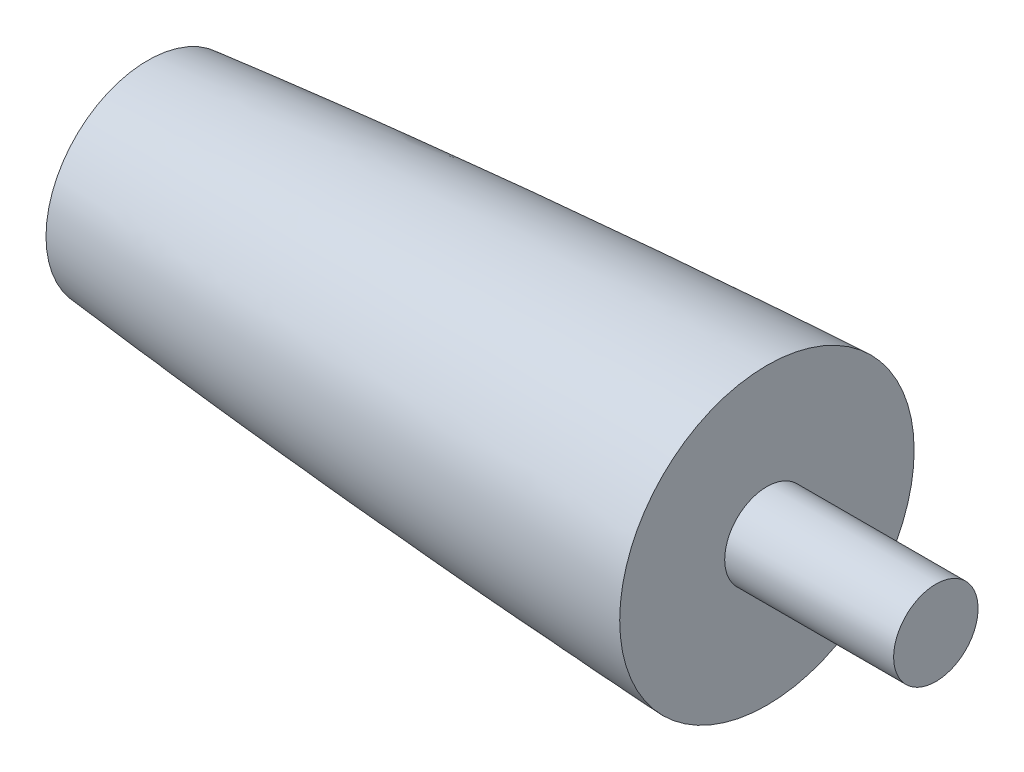
ISO-10303-21;
HEADER;
FILE_DESCRIPTION(('STEP AP214'),'2;1');
FILE_NAME('part.step','',(''),(''),'','','');
FILE_SCHEMA(('AUTOMOTIVE_DESIGN { 1 0 10303 214 1 1 1 1 }'));
ENDSEC;
DATA;
#1=APPLICATION_CONTEXT('core data for automotive mechanical design processes');
#2=APPLICATION_PROTOCOL_DEFINITION('international standard','automotive_design',2000,#1);
#3=PRODUCT_CONTEXT('',#1,'mechanical');
#4=PRODUCT('Part','Part','',(#3));
#5=PRODUCT_RELATED_PRODUCT_CATEGORY('part','',(#4));
#6=PRODUCT_DEFINITION_FORMATION('','',#4);
#7=PRODUCT_DEFINITION_CONTEXT('part definition',#1,'design');
#8=PRODUCT_DEFINITION('design','',#6,#7);
#9=PRODUCT_DEFINITION_SHAPE('','',#8);
#10=(LENGTH_UNIT() NAMED_UNIT(*) SI_UNIT(.MILLI.,.METRE.));
#11=(NAMED_UNIT(*) PLANE_ANGLE_UNIT() SI_UNIT($,.RADIAN.));
#12=(NAMED_UNIT(*) SI_UNIT($,.STERADIAN.) SOLID_ANGLE_UNIT());
#13=UNCERTAINTY_MEASURE_WITH_UNIT(LENGTH_MEASURE(1.E-05),#10,'distance_accuracy_value','');
#14=(GEOMETRIC_REPRESENTATION_CONTEXT(3) GLOBAL_UNCERTAINTY_ASSIGNED_CONTEXT((#13)) GLOBAL_UNIT_ASSIGNED_CONTEXT((#10,
#11,#12)) REPRESENTATION_CONTEXT('',''));
#15=CARTESIAN_POINT('',(0.,0.,0.));
#16=DIRECTION('',(0.,0.,1.));
#17=DIRECTION('',(1.,0.,0.));
#18=AXIS2_PLACEMENT_3D('',#15,#16,#17);
#19=CARTESIAN_POINT('',(186.20000000084,0.,0.));
#20=DIRECTION('',(-1.,0.,0.));
#21=DIRECTION('',(0.,0.,1.));
#22=AXIS2_PLACEMENT_3D('',#19,#20,#21);
#23=CYLINDRICAL_SURFACE('',#22,12.7000000005298);
#24=CARTESIAN_POINT('',(372.400000000217,0.,0.));
#25=DIRECTION('',(-1.,0.,0.));
#26=DIRECTION('',(0.,0.,1.));
#27=AXIS2_PLACEMENT_3D('',#24,#25,#26);
#28=CIRCLE('',#27,12.7000000005298);
#29=CARTESIAN_POINT('',(372.400000000217,0.,12.7000000005298));
#30=VERTEX_POINT('',#29);
#31=EDGE_CURVE('E10',#30,#30,#28,.T.);
#32=ORIENTED_EDGE('',*,*,#31,.F.);
#33=EDGE_LOOP('',(#32));
#34=FACE_BOUND('',#33,.T.);
#35=CARTESIAN_POINT('',(423.20000000084,0.,0.));
#36=DIRECTION('',(-1.,0.,0.));
#37=DIRECTION('',(0.,0.,1.));
#38=AXIS2_PLACEMENT_3D('',#35,#36,#37);
#39=CIRCLE('',#38,12.7000000005298);
#40=CARTESIAN_POINT('',(423.20000000084,0.,12.7000000005298));
#41=VERTEX_POINT('',#40);
#42=EDGE_CURVE('E60',#41,#41,#39,.T.);
#43=ORIENTED_EDGE('',*,*,#42,.T.);
#44=EDGE_LOOP('',(#43));
#45=FACE_BOUND('',#44,.T.);
#46=ADVANCED_FACE('F43',(#34,#45),#23,.T.);
#47=CARTESIAN_POINT('',(372.400000000217,0.,-12.7000000005298));
#48=DIRECTION('',(-1.,0.,0.));
#49=DIRECTION('',(0.,0.,1.));
#50=AXIS2_PLACEMENT_3D('',#47,#48,#49);
#51=PLANE('',#50);
#52=CARTESIAN_POINT('',(372.400000000218,0.,0.));
#53=DIRECTION('',(-1.,0.,0.));
#54=DIRECTION('',(0.,0.,1.));
#55=AXIS2_PLACEMENT_3D('',#52,#53,#54);
#56=CIRCLE('',#55,44.2733098966347);
#57=CARTESIAN_POINT('',(372.400000000218,0.,44.2733098966347));
#58=VERTEX_POINT('',#57);
#59=EDGE_CURVE('E50',#58,#58,#56,.T.);
#60=ORIENTED_EDGE('',*,*,#59,.F.);
#61=EDGE_LOOP('',(#60));
#62=FACE_BOUND('',#61,.T.);
#63=ORIENTED_EDGE('',*,*,#31,.T.);
#64=EDGE_LOOP('',(#63));
#65=FACE_BOUND('',#64,.T.);
#66=ADVANCED_FACE('F81',(#62,#65),#51,.F.);
#67=CARTESIAN_POINT('',(372.400000000218,0.,-44.2733098966347));
#68=CARTESIAN_POINT('',(371.099720463072,0.,-44.2086151452779));
#69=CARTESIAN_POINT('',(368.611069259117,0.,-44.0833064735133));
#70=CARTESIAN_POINT('',(362.148157594563,0.,-43.7550407635091));
#71=CARTESIAN_POINT('',(357.349407841258,0.,-43.4983234281676));
#72=CARTESIAN_POINT('',(350.247968857409,0.,-43.1179531724851));
#73=CARTESIAN_POINT('',(344.538046525034,0.,-42.7976627815326));
#74=CARTESIAN_POINT('',(337.985390815137,0.,-42.426210406292));
#75=CARTESIAN_POINT('',(331.944868664859,0.,-42.0709298334749));
#76=CARTESIAN_POINT('',(325.595023530856,0.,-41.6908599032036));
#77=CARTESIAN_POINT('',(319.432376422938,0.,-41.3106244348941));
#78=CARTESIAN_POINT('',(313.159719823633,0.,-40.9153277218792));
#79=CARTESIAN_POINT('',(306.95040945839,0.,-40.5135189398135));
#80=CARTESIAN_POINT('',(299.150136565689,0.,-39.9970840704072));
#81=CARTESIAN_POINT('',(289.813469818878,0.,-39.358798501315));
#82=CARTESIAN_POINT('',(279.058990579923,0.,-38.5948191475742));
#83=CARTESIAN_POINT('',(268.31768795884,0.,-37.7965658936002));
#84=CARTESIAN_POINT('',(259.127242371907,0.,-37.0880129546505));
#85=CARTESIAN_POINT('',(251.501020324054,0.,-36.4827886986872));
#86=CARTESIAN_POINT('',(245.272686440296,0.,-35.9773995888363));
#87=CARTESIAN_POINT('',(239.057201083237,0.,-35.4620558620206));
#88=CARTESIAN_POINT('',(232.822781340289,0.,-34.9334352152066));
#89=CARTESIAN_POINT('',(226.622208019926,0.,-34.3966158999864));
#90=CARTESIAN_POINT('',(220.368431816491,0.,-33.8426435089571));
#91=CARTESIAN_POINT('',(214.205422428785,0.,-33.2857845903212));
#92=CARTESIAN_POINT('',(207.893685757515,0.,-32.7016827812862));
#93=CARTESIAN_POINT('',(201.840886625416,0.,-32.1311519984326));
#94=CARTESIAN_POINT('',(196.124455044071,0.,-31.5784145355312));
#95=CARTESIAN_POINT('',(191.918845769157,0.,-31.1664085820365));
#96=CARTESIAN_POINT('',(188.168076882751,0.,-30.7918904818598));
#97=CARTESIAN_POINT('',(186.847665210424,0.,-30.6594231194268));
#98=CARTESIAN_POINT('',(186.200000001049,0.,-30.5941707053893));
#99=B_SPLINE_CURVE_WITH_KNOTS('',4,(#67,#68,#69,#70,#71,#72,#73,#74,#75,#76,#77,#78,#79,#80,#81,
#82,#83,#84,#85,#86,#87,#88,#89,#90,#91,#92,#93,#94,#95,#96,#97,#98),.UNSPECIFIED.,.F.,.F.,(5,1,
1,1,1,1,1,1,1,1,1,1,1,1,1,1,1,1,1,1,1,1,1,1,1,1,1,1,5),(0.0827768048580882,0.11066622585216,
0.138555646846232,0.166445067869085,0.194334488891938,0.222223909944512,0.250113330997087,
0.278002752086012,0.305892173174936,0.333781594300355,0.361671015425774,0.389560436506726,
0.417449857587679,0.4732286995838,0.529007541618621,0.582068952737572,0.609958373429811,
0.637847794705873,0.665737215664051,0.693626637259384,0.721516058130789,0.749405479364653,
0.777294899799167,0.805184320935196,0.833073741614096,0.860963163334868,0.888852584153024,
0.90279729514093,0.916742006128835),.UNSPECIFIED.);
#100=CARTESIAN_POINT('',(186.20000000084,0.,0.));
#101=DIRECTION('',(-1.,0.,0.));
#102=AXIS1_PLACEMENT('',#100,#101);
#103=SURFACE_OF_REVOLUTION('',#99,#102);
#104=CARTESIAN_POINT('',(186.20000000084,0.,0.));
#105=DIRECTION('',(-1.,0.,0.));
#106=DIRECTION('',(0.,0.,1.));
#107=AXIS2_PLACEMENT_3D('',#104,#105,#106);
#108=CIRCLE('',#107,30.5941707053683);
#109=CARTESIAN_POINT('',(186.20000000084,0.,30.5941707053683));
#110=VERTEX_POINT('',#109);
#111=EDGE_CURVE('E55',#110,#110,#108,.T.);
#112=ORIENTED_EDGE('',*,*,#111,.F.);
#113=EDGE_LOOP('',(#112));
#114=FACE_BOUND('',#113,.T.);
#115=ORIENTED_EDGE('',*,*,#59,.T.);
#116=EDGE_LOOP('',(#115));
#117=FACE_BOUND('',#116,.T.);
#118=ADVANCED_FACE('F77',(#114,#117),#103,.T.);
#119=CARTESIAN_POINT('',(186.20000000084,0.,-30.5941707053683));
#120=DIRECTION('',(1.,0.,0.));
#121=DIRECTION('',(0.,0.,-1.));
#122=AXIS2_PLACEMENT_3D('',#119,#120,#121);
#123=PLANE('',#122);
#124=CARTESIAN_POINT('',(186.20000000084,0.,0.));
#125=DIRECTION('',(-1.,0.,0.));
#126=DIRECTION('',(0.,0.,1.));
#127=AXIS2_PLACEMENT_3D('',#124,#125,#126);
#128=CIRCLE('',#127,12.7);
#129=CARTESIAN_POINT('',(186.20000000084,0.,12.7));
#130=VERTEX_POINT('',#129);
#131=EDGE_CURVE('E71',#130,#130,#128,.T.);
#132=ORIENTED_EDGE('',*,*,#131,.F.);
#133=EDGE_LOOP('',(#132));
#134=FACE_BOUND('',#133,.T.);
#135=ORIENTED_EDGE('',*,*,#111,.T.);
#136=EDGE_LOOP('',(#135));
#137=FACE_BOUND('',#136,.T.);
#138=ADVANCED_FACE('F80',(#134,#137),#123,.F.);
#139=CARTESIAN_POINT('',(423.20000000084,0.,0.));
#140=DIRECTION('',(-1.,0.,0.));
#141=DIRECTION('',(0.,0.,1.));
#142=AXIS2_PLACEMENT_3D('',#139,#140,#141);
#143=PLANE('',#142);
#144=ORIENTED_EDGE('',*,*,#42,.F.);
#145=EDGE_LOOP('',(#144));
#146=FACE_BOUND('',#145,.T.);
#147=ADVANCED_FACE('F95',(#146),#143,.F.);
#148=CARTESIAN_POINT('',(237.00000000084,0.,0.));
#149=DIRECTION('',(-1.,0.,0.));
#150=DIRECTION('',(0.,0.,1.));
#151=AXIS2_PLACEMENT_3D('',#148,#149,#150);
#152=CYLINDRICAL_SURFACE('',#151,12.7);
#153=CARTESIAN_POINT('',(237.00000000084,0.,0.));
#154=DIRECTION('',(-1.,0.,0.));
#155=DIRECTION('',(0.,0.,1.));
#156=AXIS2_PLACEMENT_3D('',#153,#154,#155);
#157=CIRCLE('',#156,12.7);
#158=CARTESIAN_POINT('',(237.00000000084,0.,12.7));
#159=VERTEX_POINT('',#158);
#160=EDGE_CURVE('E66',#159,#159,#157,.T.);
#161=ORIENTED_EDGE('',*,*,#160,.F.);
#162=EDGE_LOOP('',(#161));
#163=FACE_BOUND('',#162,.T.);
#164=ORIENTED_EDGE('',*,*,#131,.T.);
#165=EDGE_LOOP('',(#164));
#166=FACE_BOUND('',#165,.T.);
#167=ADVANCED_FACE('F97',(#163,#166),#152,.F.);
#168=CARTESIAN_POINT('',(237.00000000084,0.,0.));
#169=DIRECTION('',(-1.,0.,0.));
#170=DIRECTION('',(0.,0.,1.));
#171=AXIS2_PLACEMENT_3D('',#168,#169,#170);
#172=PLANE('',#171);
#173=ORIENTED_EDGE('',*,*,#160,.T.);
#174=EDGE_LOOP('',(#173));
#175=FACE_BOUND('',#174,.T.);
#176=ADVANCED_FACE('F102',(#175),#172,.T.);
#177=CLOSED_SHELL('',(#46,#66,#118,#138,#147,#167,#176));
#178=MANIFOLD_SOLID_BREP('B2',#177);
#179=ADVANCED_BREP_SHAPE_REPRESENTATION('',(#18,#178),#14);
#180=SHAPE_DEFINITION_REPRESENTATION(#9,#179);
ENDSEC;
END-ISO-10303-21;
